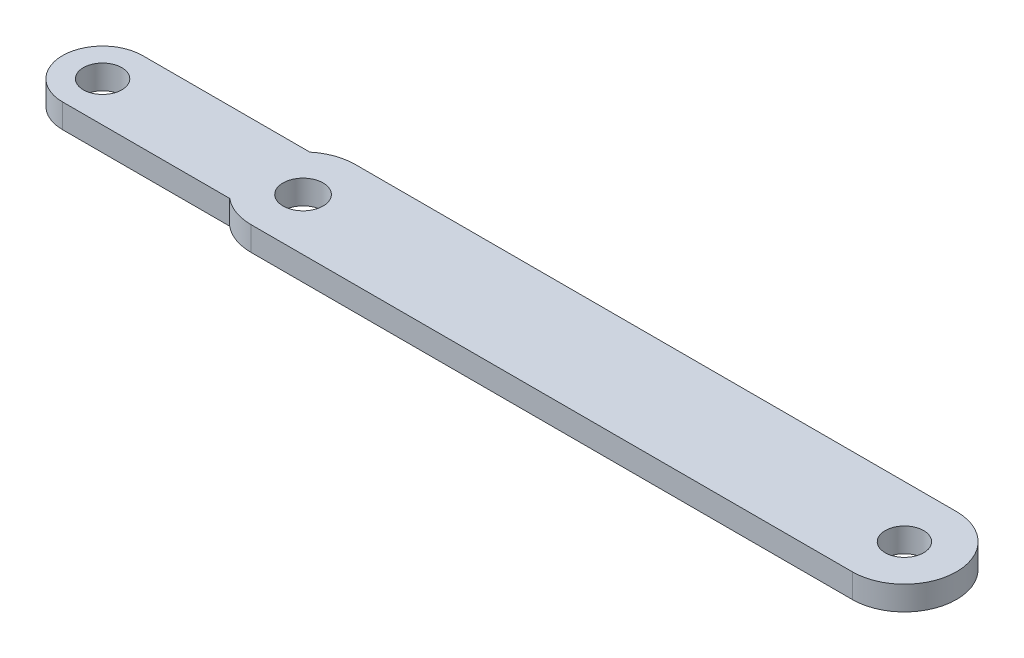
ISO-10303-21;
HEADER;
FILE_DESCRIPTION(('STEP AP214'),'2;1');
FILE_NAME('part.step','',(''),(''),'','','');
FILE_SCHEMA(('AUTOMOTIVE_DESIGN { 1 0 10303 214 1 1 1 1 }'));
ENDSEC;
DATA;
#1=APPLICATION_CONTEXT('core data for automotive mechanical design processes');
#2=APPLICATION_PROTOCOL_DEFINITION('international standard','automotive_design',2000,#1);
#3=PRODUCT_CONTEXT('',#1,'mechanical');
#4=PRODUCT('Part','Part','',(#3));
#5=PRODUCT_RELATED_PRODUCT_CATEGORY('part','',(#4));
#6=PRODUCT_DEFINITION_FORMATION('','',#4);
#7=PRODUCT_DEFINITION_CONTEXT('part definition',#1,'design');
#8=PRODUCT_DEFINITION('design','',#6,#7);
#9=PRODUCT_DEFINITION_SHAPE('','',#8);
#10=(LENGTH_UNIT() NAMED_UNIT(*) SI_UNIT(.MILLI.,.METRE.));
#11=(NAMED_UNIT(*) PLANE_ANGLE_UNIT() SI_UNIT($,.RADIAN.));
#12=(NAMED_UNIT(*) SI_UNIT($,.STERADIAN.) SOLID_ANGLE_UNIT());
#13=UNCERTAINTY_MEASURE_WITH_UNIT(LENGTH_MEASURE(1.E-05),#10,'distance_accuracy_value','');
#14=(GEOMETRIC_REPRESENTATION_CONTEXT(3) GLOBAL_UNCERTAINTY_ASSIGNED_CONTEXT((#13)) GLOBAL_UNIT_ASSIGNED_CONTEXT((#10,
#11,#12)) REPRESENTATION_CONTEXT('',''));
#15=CARTESIAN_POINT('',(0.,0.,0.));
#16=DIRECTION('',(0.,0.,1.));
#17=DIRECTION('',(1.,0.,0.));
#18=AXIS2_PLACEMENT_3D('',#15,#16,#17);
#19=CARTESIAN_POINT('',(0.,3.,-197.318492307149));
#20=DIRECTION('',(0.,0.,1.));
#21=DIRECTION('',(1.,0.,0.));
#22=AXIS2_PLACEMENT_3D('',#19,#20,#21);
#23=PLANE('',#22);
#24=DIRECTION('',(-1.,0.,0.));
#25=VECTOR('',#24,1.);
#26=CARTESIAN_POINT('',(0.,0.,-197.318492307149));
#27=LINE('',#26,#25);
#28=CARTESIAN_POINT('',(8.44031117312527,0.,-197.318492307149));
#29=VERTEX_POINT('',#28);
#30=CARTESIAN_POINT('',(-12.4063768954157,0.,-197.318492307149));
#31=VERTEX_POINT('',#30);
#32=EDGE_CURVE('E147',#29,#31,#27,.T.);
#33=ORIENTED_EDGE('',*,*,#32,.T.);
#34=DIRECTION('',(0.,-1.,0.));
#35=VECTOR('',#34,1.);
#36=CARTESIAN_POINT('',(-12.4063768954157,3.,-197.318492307149));
#37=LINE('',#36,#35);
#38=CARTESIAN_POINT('',(-12.4063768954157,3.,-197.318492307149));
#39=VERTEX_POINT('',#38);
#40=EDGE_CURVE('E11',#39,#31,#37,.T.);
#41=ORIENTED_EDGE('',*,*,#40,.F.);
#42=DIRECTION('',(-1.,0.,0.));
#43=VECTOR('',#42,1.);
#44=CARTESIAN_POINT('',(0.,3.,-197.318492307149));
#45=LINE('',#44,#43);
#46=CARTESIAN_POINT('',(8.44031117312527,3.,-197.318492307149));
#47=VERTEX_POINT('',#46);
#48=EDGE_CURVE('E201',#47,#39,#45,.T.);
#49=ORIENTED_EDGE('',*,*,#48,.F.);
#50=DIRECTION('',(0.,-1.,0.));
#51=VECTOR('',#50,1.);
#52=CARTESIAN_POINT('',(8.44031117312527,3.,-197.318492307149));
#53=LINE('',#52,#51);
#54=EDGE_CURVE('E143',#47,#29,#53,.T.);
#55=ORIENTED_EDGE('',*,*,#54,.T.);
#56=EDGE_LOOP('',(#33,#41,#49,#55));
#57=FACE_BOUND('',#56,.T.);
#58=ADVANCED_FACE('F41',(#57),#23,.F.);
#59=CARTESIAN_POINT('',(-12.4063768954157,3.,-192.318492307149));
#60=DIRECTION('',(0.,-1.,0.));
#61=DIRECTION('',(0.,0.,-1.));
#62=AXIS2_PLACEMENT_3D('',#59,#60,#61);
#63=CYLINDRICAL_SURFACE('',#62,5.);
#64=CARTESIAN_POINT('',(-12.4063768954157,0.,-192.318492307149));
#65=DIRECTION('',(0.,1.,0.));
#66=DIRECTION('',(0.,0.,1.));
#67=AXIS2_PLACEMENT_3D('',#64,#65,#66);
#68=CIRCLE('',#67,5.);
#69=CARTESIAN_POINT('',(-12.4063768954157,0.,-187.318492307149));
#70=VERTEX_POINT('',#69);
#71=EDGE_CURVE('E150',#31,#70,#68,.T.);
#72=ORIENTED_EDGE('',*,*,#71,.T.);
#73=DIRECTION('',(0.,-1.,0.));
#74=VECTOR('',#73,1.);
#75=CARTESIAN_POINT('',(-12.4063768954157,3.,-187.318492307149));
#76=LINE('',#75,#74);
#77=CARTESIAN_POINT('',(-12.4063768954157,3.,-187.318492307149));
#78=VERTEX_POINT('',#77);
#79=EDGE_CURVE('E50',#78,#70,#76,.T.);
#80=ORIENTED_EDGE('',*,*,#79,.F.);
#81=CARTESIAN_POINT('',(-12.4063768954157,3.,-192.318492307149));
#82=DIRECTION('',(0.,1.,0.));
#83=DIRECTION('',(0.,0.,1.));
#84=AXIS2_PLACEMENT_3D('',#81,#82,#83);
#85=CIRCLE('',#84,5.);
#86=EDGE_CURVE('E97',#39,#78,#85,.T.);
#87=ORIENTED_EDGE('',*,*,#86,.F.);
#88=ORIENTED_EDGE('',*,*,#40,.T.);
#89=EDGE_LOOP('',(#72,#80,#87,#88));
#90=FACE_BOUND('',#89,.T.);
#91=ADVANCED_FACE('F184',(#90),#63,.T.);
#92=CARTESIAN_POINT('',(0.,3.,-187.318492307149));
#93=DIRECTION('',(0.,0.,1.));
#94=DIRECTION('',(1.,0.,0.));
#95=AXIS2_PLACEMENT_3D('',#92,#93,#94);
#96=PLANE('',#95);
#97=DIRECTION('',(-1.,0.,0.));
#98=VECTOR('',#97,1.);
#99=CARTESIAN_POINT('',(0.,0.,-187.318492307149));
#100=LINE('',#99,#98);
#101=CARTESIAN_POINT('',(8.44031117312527,0.,-187.318492307149));
#102=VERTEX_POINT('',#101);
#103=EDGE_CURVE('E153',#102,#70,#100,.T.);
#104=ORIENTED_EDGE('',*,*,#103,.F.);
#105=DIRECTION('',(0.,-1.,0.));
#106=VECTOR('',#105,1.);
#107=CARTESIAN_POINT('',(8.44031117312527,3.,-187.318492307149));
#108=LINE('',#107,#106);
#109=CARTESIAN_POINT('',(8.44031117312527,3.,-187.318492307149));
#110=VERTEX_POINT('',#109);
#111=EDGE_CURVE('E177',#110,#102,#108,.T.);
#112=ORIENTED_EDGE('',*,*,#111,.F.);
#113=DIRECTION('',(-1.,0.,0.));
#114=VECTOR('',#113,1.);
#115=CARTESIAN_POINT('',(0.,3.,-187.318492307149));
#116=LINE('',#115,#114);
#117=EDGE_CURVE('E183',#110,#78,#116,.T.);
#118=ORIENTED_EDGE('',*,*,#117,.T.);
#119=ORIENTED_EDGE('',*,*,#79,.T.);
#120=EDGE_LOOP('',(#104,#112,#118,#119));
#121=FACE_BOUND('',#120,.T.);
#122=ADVANCED_FACE('F181',(#121),#96,.T.);
#123=CARTESIAN_POINT('',(12.5936231045843,3.,-192.318492307149));
#124=DIRECTION('',(0.,-1.,0.));
#125=DIRECTION('',(0.,0.,-1.));
#126=AXIS2_PLACEMENT_3D('',#123,#124,#125);
#127=CYLINDRICAL_SURFACE('',#126,6.50000000000001);
#128=CARTESIAN_POINT('',(12.5936231045843,0.,-192.318492307149));
#129=DIRECTION('',(0.,1.,0.));
#130=DIRECTION('',(0.,0.,1.));
#131=AXIS2_PLACEMENT_3D('',#128,#129,#130);
#132=CIRCLE('',#131,6.50000000000001);
#133=CARTESIAN_POINT('',(12.5936231045843,0.,-185.818492307149));
#134=VERTEX_POINT('',#133);
#135=EDGE_CURVE('E156',#102,#134,#132,.T.);
#136=ORIENTED_EDGE('',*,*,#135,.T.);
#137=DIRECTION('',(0.,-1.,0.));
#138=VECTOR('',#137,1.);
#139=CARTESIAN_POINT('',(12.5936231045843,3.,-185.818492307149));
#140=LINE('',#139,#138);
#141=CARTESIAN_POINT('',(12.5936231045843,3.,-185.818492307149));
#142=VERTEX_POINT('',#141);
#143=EDGE_CURVE('E174',#142,#134,#140,.T.);
#144=ORIENTED_EDGE('',*,*,#143,.F.);
#145=CARTESIAN_POINT('',(12.5936231045843,3.,-192.318492307149));
#146=DIRECTION('',(0.,1.,0.));
#147=DIRECTION('',(0.,0.,1.));
#148=AXIS2_PLACEMENT_3D('',#145,#146,#147);
#149=CIRCLE('',#148,6.50000000000001);
#150=EDGE_CURVE('E135',#110,#142,#149,.T.);
#151=ORIENTED_EDGE('',*,*,#150,.F.);
#152=ORIENTED_EDGE('',*,*,#111,.T.);
#153=EDGE_LOOP('',(#136,#144,#151,#152));
#154=FACE_BOUND('',#153,.T.);
#155=ADVANCED_FACE('F194',(#154),#127,.T.);
#156=CARTESIAN_POINT('',(0.,3.,-185.818492307149));
#157=DIRECTION('',(0.,0.,-1.));
#158=DIRECTION('',(-1.,0.,0.));
#159=AXIS2_PLACEMENT_3D('',#156,#157,#158);
#160=PLANE('',#159);
#161=DIRECTION('',(1.,0.,0.));
#162=VECTOR('',#161,1.);
#163=CARTESIAN_POINT('',(0.,0.,-185.818492307149));
#164=LINE('',#163,#162);
#165=CARTESIAN_POINT('',(87.5936231045843,0.,-185.818492307149));
#166=VERTEX_POINT('',#165);
#167=EDGE_CURVE('E158',#134,#166,#164,.T.);
#168=ORIENTED_EDGE('',*,*,#167,.T.);
#169=DIRECTION('',(0.,-1.,0.));
#170=VECTOR('',#169,1.);
#171=CARTESIAN_POINT('',(87.5936231045843,3.,-185.818492307149));
#172=LINE('',#171,#170);
#173=CARTESIAN_POINT('',(87.5936231045843,3.,-185.818492307149));
#174=VERTEX_POINT('',#173);
#175=EDGE_CURVE('E122',#174,#166,#172,.T.);
#176=ORIENTED_EDGE('',*,*,#175,.F.);
#177=DIRECTION('',(1.,0.,0.));
#178=VECTOR('',#177,1.);
#179=CARTESIAN_POINT('',(0.,3.,-185.818492307149));
#180=LINE('',#179,#178);
#181=EDGE_CURVE('E128',#142,#174,#180,.T.);
#182=ORIENTED_EDGE('',*,*,#181,.F.);
#183=ORIENTED_EDGE('',*,*,#143,.T.);
#184=EDGE_LOOP('',(#168,#176,#182,#183));
#185=FACE_BOUND('',#184,.T.);
#186=ADVANCED_FACE('F197',(#185),#160,.F.);
#187=CARTESIAN_POINT('',(87.5936231045843,3.,-192.318492307149));
#188=DIRECTION('',(0.,-1.,0.));
#189=DIRECTION('',(0.,0.,-1.));
#190=AXIS2_PLACEMENT_3D('',#187,#188,#189);
#191=CYLINDRICAL_SURFACE('',#190,6.50000000000001);
#192=CARTESIAN_POINT('',(87.5936231045843,0.,-192.318492307149));
#193=DIRECTION('',(0.,1.,0.));
#194=DIRECTION('',(0.,0.,1.));
#195=AXIS2_PLACEMENT_3D('',#192,#193,#194);
#196=CIRCLE('',#195,6.50000000000001);
#197=CARTESIAN_POINT('',(87.5936231045843,0.,-198.818492307149));
#198=VERTEX_POINT('',#197);
#199=EDGE_CURVE('E117',#198,#166,#196,.F.);
#200=ORIENTED_EDGE('',*,*,#199,.F.);
#201=DIRECTION('',(0.,-1.,0.));
#202=VECTOR('',#201,1.);
#203=CARTESIAN_POINT('',(87.5936231045843,3.,-198.818492307149));
#204=LINE('',#203,#202);
#205=CARTESIAN_POINT('',(87.5936231045843,3.,-198.818492307149));
#206=VERTEX_POINT('',#205);
#207=EDGE_CURVE('E112',#206,#198,#204,.T.);
#208=ORIENTED_EDGE('',*,*,#207,.F.);
#209=CARTESIAN_POINT('',(87.5936231045843,3.,-192.318492307149));
#210=DIRECTION('',(0.,1.,0.));
#211=DIRECTION('',(0.,0.,1.));
#212=AXIS2_PLACEMENT_3D('',#209,#210,#211);
#213=CIRCLE('',#212,6.50000000000001);
#214=EDGE_CURVE('E115',#206,#174,#213,.F.);
#215=ORIENTED_EDGE('',*,*,#214,.T.);
#216=ORIENTED_EDGE('',*,*,#175,.T.);
#217=EDGE_LOOP('',(#200,#208,#215,#216));
#218=FACE_BOUND('',#217,.T.);
#219=ADVANCED_FACE('F114',(#218),#191,.T.);
#220=CARTESIAN_POINT('',(0.,3.,-198.818492307149));
#221=DIRECTION('',(0.,0.,-1.));
#222=DIRECTION('',(-1.,0.,0.));
#223=AXIS2_PLACEMENT_3D('',#220,#221,#222);
#224=PLANE('',#223);
#225=DIRECTION('',(1.,0.,0.));
#226=VECTOR('',#225,1.);
#227=CARTESIAN_POINT('',(0.,0.,-198.818492307149));
#228=LINE('',#227,#226);
#229=CARTESIAN_POINT('',(12.5936231045843,0.,-198.818492307149));
#230=VERTEX_POINT('',#229);
#231=EDGE_CURVE('E162',#230,#198,#228,.T.);
#232=ORIENTED_EDGE('',*,*,#231,.F.);
#233=DIRECTION('',(0.,-1.,0.));
#234=VECTOR('',#233,1.);
#235=CARTESIAN_POINT('',(12.5936231045843,3.,-198.818492307149));
#236=LINE('',#235,#234);
#237=CARTESIAN_POINT('',(12.5936231045843,3.,-198.818492307149));
#238=VERTEX_POINT('',#237);
#239=EDGE_CURVE('E86',#238,#230,#236,.T.);
#240=ORIENTED_EDGE('',*,*,#239,.F.);
#241=DIRECTION('',(1.,0.,0.));
#242=VECTOR('',#241,1.);
#243=CARTESIAN_POINT('',(0.,3.,-198.818492307149));
#244=LINE('',#243,#242);
#245=EDGE_CURVE('E126',#238,#206,#244,.T.);
#246=ORIENTED_EDGE('',*,*,#245,.T.);
#247=ORIENTED_EDGE('',*,*,#207,.T.);
#248=EDGE_LOOP('',(#232,#240,#246,#247));
#249=FACE_BOUND('',#248,.T.);
#250=ADVANCED_FACE('F131',(#249),#224,.T.);
#251=CARTESIAN_POINT('',(12.5936231045843,3.,-192.318492307149));
#252=DIRECTION('',(0.,-1.,0.));
#253=DIRECTION('',(0.,0.,-1.));
#254=AXIS2_PLACEMENT_3D('',#251,#252,#253);
#255=CYLINDRICAL_SURFACE('',#254,2.5);
#256=CARTESIAN_POINT('',(12.5936231045843,3.,-192.318492307149));
#257=DIRECTION('',(0.,1.,0.));
#258=DIRECTION('',(0.,0.,1.));
#259=AXIS2_PLACEMENT_3D('',#256,#257,#258);
#260=CIRCLE('',#259,2.5);
#261=CARTESIAN_POINT('',(12.5936231045843,3.,-189.818492307149));
#262=VERTEX_POINT('',#261);
#263=EDGE_CURVE('E133',#262,#262,#260,.T.);
#264=ORIENTED_EDGE('',*,*,#263,.T.);
#265=EDGE_LOOP('',(#264));
#266=FACE_BOUND('',#265,.T.);
#267=CARTESIAN_POINT('',(12.5936231045843,0.,-192.318492307149));
#268=DIRECTION('',(0.,1.,0.));
#269=DIRECTION('',(0.,0.,1.));
#270=AXIS2_PLACEMENT_3D('',#267,#268,#269);
#271=CIRCLE('',#270,2.5);
#272=CARTESIAN_POINT('',(12.5936231045843,0.,-189.818492307149));
#273=VERTEX_POINT('',#272);
#274=EDGE_CURVE('E164',#273,#273,#271,.T.);
#275=ORIENTED_EDGE('',*,*,#274,.F.);
#276=EDGE_LOOP('',(#275));
#277=FACE_BOUND('',#276,.T.);
#278=ADVANCED_FACE('F234',(#266,#277),#255,.F.);
#279=EDGE_CURVE('E89',#230,#29,#132,.T.);
#280=ORIENTED_EDGE('',*,*,#279,.T.);
#281=ORIENTED_EDGE('',*,*,#54,.F.);
#282=EDGE_CURVE('E58',#238,#47,#149,.T.);
#283=ORIENTED_EDGE('',*,*,#282,.F.);
#284=ORIENTED_EDGE('',*,*,#239,.T.);
#285=EDGE_LOOP('',(#280,#281,#283,#284));
#286=FACE_BOUND('',#285,.T.);
#287=ADVANCED_FACE('F235',(#286),#127,.T.);
#288=CARTESIAN_POINT('',(-12.4063768954157,3.,-192.318492307149));
#289=DIRECTION('',(0.,-1.,0.));
#290=DIRECTION('',(0.,0.,-1.));
#291=AXIS2_PLACEMENT_3D('',#288,#289,#290);
#292=CYLINDRICAL_SURFACE('',#291,2.4);
#293=CARTESIAN_POINT('',(-12.4063768954157,3.,-192.318492307149));
#294=DIRECTION('',(0.,1.,0.));
#295=DIRECTION('',(0.,0.,1.));
#296=AXIS2_PLACEMENT_3D('',#293,#294,#295);
#297=CIRCLE('',#296,2.4);
#298=CARTESIAN_POINT('',(-12.4063768954157,3.,-189.918492307149));
#299=VERTEX_POINT('',#298);
#300=EDGE_CURVE('E170',#299,#299,#297,.T.);
#301=ORIENTED_EDGE('',*,*,#300,.T.);
#302=EDGE_LOOP('',(#301));
#303=FACE_BOUND('',#302,.T.);
#304=CARTESIAN_POINT('',(-12.4063768954157,0.,-192.318492307149));
#305=DIRECTION('',(0.,1.,0.));
#306=DIRECTION('',(0.,0.,1.));
#307=AXIS2_PLACEMENT_3D('',#304,#305,#306);
#308=CIRCLE('',#307,2.4);
#309=CARTESIAN_POINT('',(-12.4063768954157,0.,-189.918492307149));
#310=VERTEX_POINT('',#309);
#311=EDGE_CURVE('E144',#310,#310,#308,.T.);
#312=ORIENTED_EDGE('',*,*,#311,.F.);
#313=EDGE_LOOP('',(#312));
#314=FACE_BOUND('',#313,.T.);
#315=ADVANCED_FACE('F43',(#303,#314),#292,.F.);
#316=CARTESIAN_POINT('',(87.5936231045843,3.,-192.318492307149));
#317=DIRECTION('',(0.,-1.,0.));
#318=DIRECTION('',(0.,0.,-1.));
#319=AXIS2_PLACEMENT_3D('',#316,#317,#318);
#320=CYLINDRICAL_SURFACE('',#319,2.4);
#321=CARTESIAN_POINT('',(87.5936231045843,3.,-192.318492307149));
#322=DIRECTION('',(0.,1.,0.));
#323=DIRECTION('',(0.,0.,1.));
#324=AXIS2_PLACEMENT_3D('',#321,#322,#323);
#325=CIRCLE('',#324,2.4);
#326=CARTESIAN_POINT('',(87.5936231045843,3.,-189.918492307149));
#327=VERTEX_POINT('',#326);
#328=EDGE_CURVE('E140',#327,#327,#325,.T.);
#329=ORIENTED_EDGE('',*,*,#328,.T.);
#330=EDGE_LOOP('',(#329));
#331=FACE_BOUND('',#330,.T.);
#332=CARTESIAN_POINT('',(87.5936231045843,0.,-192.318492307149));
#333=DIRECTION('',(0.,1.,0.));
#334=DIRECTION('',(0.,0.,1.));
#335=AXIS2_PLACEMENT_3D('',#332,#333,#334);
#336=CIRCLE('',#335,2.4);
#337=CARTESIAN_POINT('',(87.5936231045843,0.,-189.918492307149));
#338=VERTEX_POINT('',#337);
#339=EDGE_CURVE('E167',#338,#338,#336,.T.);
#340=ORIENTED_EDGE('',*,*,#339,.F.);
#341=EDGE_LOOP('',(#340));
#342=FACE_BOUND('',#341,.T.);
#343=ADVANCED_FACE('F209',(#331,#342),#320,.F.);
#344=CARTESIAN_POINT('',(0.,3.,0.));
#345=DIRECTION('',(0.,1.,0.));
#346=DIRECTION('',(0.,0.,1.));
#347=AXIS2_PLACEMENT_3D('',#344,#345,#346);
#348=PLANE('',#347);
#349=ORIENTED_EDGE('',*,*,#300,.F.);
#350=EDGE_LOOP('',(#349));
#351=FACE_BOUND('',#350,.T.);
#352=ORIENTED_EDGE('',*,*,#48,.T.);
#353=ORIENTED_EDGE('',*,*,#86,.T.);
#354=ORIENTED_EDGE('',*,*,#117,.F.);
#355=ORIENTED_EDGE('',*,*,#150,.T.);
#356=ORIENTED_EDGE('',*,*,#181,.T.);
#357=ORIENTED_EDGE('',*,*,#214,.F.);
#358=ORIENTED_EDGE('',*,*,#245,.F.);
#359=ORIENTED_EDGE('',*,*,#282,.T.);
#360=EDGE_LOOP('',(#352,#353,#354,#355,#356,#357,#358,#359));
#361=FACE_BOUND('',#360,.T.);
#362=ORIENTED_EDGE('',*,*,#263,.F.);
#363=EDGE_LOOP('',(#362));
#364=FACE_BOUND('',#363,.T.);
#365=ORIENTED_EDGE('',*,*,#328,.F.);
#366=EDGE_LOOP('',(#365));
#367=FACE_BOUND('',#366,.T.);
#368=ADVANCED_FACE('F124',(#351,#361,#364,#367),#348,.T.);
#369=CARTESIAN_POINT('',(0.,0.,0.));
#370=DIRECTION('',(0.,1.,0.));
#371=DIRECTION('',(0.,0.,1.));
#372=AXIS2_PLACEMENT_3D('',#369,#370,#371);
#373=PLANE('',#372);
#374=ORIENTED_EDGE('',*,*,#311,.T.);
#375=EDGE_LOOP('',(#374));
#376=FACE_BOUND('',#375,.T.);
#377=ORIENTED_EDGE('',*,*,#32,.F.);
#378=ORIENTED_EDGE('',*,*,#279,.F.);
#379=ORIENTED_EDGE('',*,*,#231,.T.);
#380=ORIENTED_EDGE('',*,*,#199,.T.);
#381=ORIENTED_EDGE('',*,*,#167,.F.);
#382=ORIENTED_EDGE('',*,*,#135,.F.);
#383=ORIENTED_EDGE('',*,*,#103,.T.);
#384=ORIENTED_EDGE('',*,*,#71,.F.);
#385=EDGE_LOOP('',(#377,#378,#379,#380,#381,#382,#383,#384));
#386=FACE_BOUND('',#385,.T.);
#387=ORIENTED_EDGE('',*,*,#274,.T.);
#388=EDGE_LOOP('',(#387));
#389=FACE_BOUND('',#388,.T.);
#390=ORIENTED_EDGE('',*,*,#339,.T.);
#391=EDGE_LOOP('',(#390));
#392=FACE_BOUND('',#391,.T.);
#393=ADVANCED_FACE('F189',(#376,#386,#389,#392),#373,.F.);
#394=CLOSED_SHELL('',(#58,#91,#122,#155,#186,#219,#250,#278,#287,#315,#343,#368,#393));
#395=MANIFOLD_SOLID_BREP('B2',#394);
#396=ADVANCED_BREP_SHAPE_REPRESENTATION('',(#18,#395),#14);
#397=SHAPE_DEFINITION_REPRESENTATION(#9,#396);
ENDSEC;
END-ISO-10303-21;
